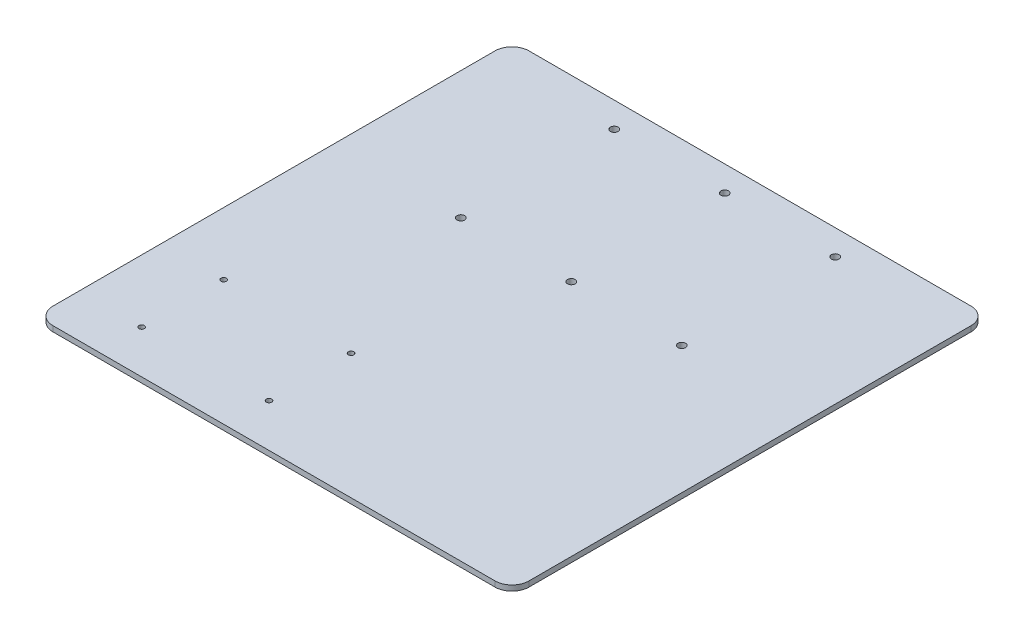
ISO-10303-21;
HEADER;
FILE_DESCRIPTION(('STEP AP214'),'2;1');
FILE_NAME('part.step','',(''),(''),'','','');
FILE_SCHEMA(('AUTOMOTIVE_DESIGN { 1 0 10303 214 1 1 1 1 }'));
ENDSEC;
DATA;
#1=APPLICATION_CONTEXT('core data for automotive mechanical design processes');
#2=APPLICATION_PROTOCOL_DEFINITION('international standard','automotive_design',2000,#1);
#3=PRODUCT_CONTEXT('',#1,'mechanical');
#4=PRODUCT('Part','Part','',(#3));
#5=PRODUCT_RELATED_PRODUCT_CATEGORY('part','',(#4));
#6=PRODUCT_DEFINITION_FORMATION('','',#4);
#7=PRODUCT_DEFINITION_CONTEXT('part definition',#1,'design');
#8=PRODUCT_DEFINITION('design','',#6,#7);
#9=PRODUCT_DEFINITION_SHAPE('','',#8);
#10=(LENGTH_UNIT() NAMED_UNIT(*) SI_UNIT(.MILLI.,.METRE.));
#11=(NAMED_UNIT(*) PLANE_ANGLE_UNIT() SI_UNIT($,.RADIAN.));
#12=(NAMED_UNIT(*) SI_UNIT($,.STERADIAN.) SOLID_ANGLE_UNIT());
#13=UNCERTAINTY_MEASURE_WITH_UNIT(LENGTH_MEASURE(1.E-05),#10,'distance_accuracy_value','');
#14=(GEOMETRIC_REPRESENTATION_CONTEXT(3) GLOBAL_UNCERTAINTY_ASSIGNED_CONTEXT((#13)) GLOBAL_UNIT_ASSIGNED_CONTEXT((#10,
#11,#12)) REPRESENTATION_CONTEXT('',''));
#15=CARTESIAN_POINT('',(0.,0.,0.));
#16=DIRECTION('',(0.,0.,1.));
#17=DIRECTION('',(1.,0.,0.));
#18=AXIS2_PLACEMENT_3D('',#15,#16,#17);
#19=CARTESIAN_POINT('',(0.,-3.18,0.));
#20=DIRECTION('',(0.,1.,0.));
#21=DIRECTION('',(0.,0.,1.));
#22=AXIS2_PLACEMENT_3D('',#19,#20,#21);
#23=PLANE('',#22);
#24=CARTESIAN_POINT('',(-65.,-3.18,-34.875));
#25=DIRECTION('',(0.,1.,0.));
#26=DIRECTION('',(0.,0.,1.));
#27=AXIS2_PLACEMENT_3D('',#24,#25,#26);
#28=CIRCLE('',#27,2.25);
#29=CARTESIAN_POINT('',(-65.,-3.18,-32.625));
#30=VERTEX_POINT('',#29);
#31=EDGE_CURVE('E210',#30,#30,#28,.T.);
#32=ORIENTED_EDGE('',*,*,#31,.T.);
#33=EDGE_LOOP('',(#32));
#34=FACE_BOUND('',#33,.T.);
#35=CARTESIAN_POINT('',(-28.285,-3.18,114.63));
#36=DIRECTION('',(0.,1.,0.));
#37=DIRECTION('',(0.,0.,1.));
#38=AXIS2_PLACEMENT_3D('',#35,#36,#37);
#39=CIRCLE('',#38,1.60000000000001);
#40=CARTESIAN_POINT('',(-28.285,-3.18,116.23));
#41=VERTEX_POINT('',#40);
#42=EDGE_CURVE('E219',#41,#41,#39,.T.);
#43=ORIENTED_EDGE('',*,*,#42,.T.);
#44=EDGE_LOOP('',(#43));
#45=FACE_BOUND('',#44,.T.);
#46=CARTESIAN_POINT('',(0.,-3.18,-34.875));
#47=DIRECTION('',(0.,1.,0.));
#48=DIRECTION('',(0.,0.,1.));
#49=AXIS2_PLACEMENT_3D('',#46,#47,#48);
#50=CIRCLE('',#49,2.25000000000001);
#51=CARTESIAN_POINT('',(0.,-3.18,-32.625));
#52=VERTEX_POINT('',#51);
#53=EDGE_CURVE('E222',#52,#52,#50,.T.);
#54=ORIENTED_EDGE('',*,*,#53,.T.);
#55=EDGE_LOOP('',(#54));
#56=FACE_BOUND('',#55,.T.);
#57=CARTESIAN_POINT('',(65.,-3.18,-34.875));
#58=DIRECTION('',(0.,1.,0.));
#59=DIRECTION('',(0.,0.,1.));
#60=AXIS2_PLACEMENT_3D('',#57,#58,#59);
#61=CIRCLE('',#60,2.25000000000001);
#62=CARTESIAN_POINT('',(65.,-3.18,-32.625));
#63=VERTEX_POINT('',#62);
#64=EDGE_CURVE('E225',#63,#63,#61,.T.);
#65=ORIENTED_EDGE('',*,*,#64,.T.);
#66=EDGE_LOOP('',(#65));
#67=FACE_BOUND('',#66,.T.);
#68=CARTESIAN_POINT('',(65.,-3.18,-125.125));
#69=DIRECTION('',(0.,1.,0.));
#70=DIRECTION('',(0.,0.,1.));
#71=AXIS2_PLACEMENT_3D('',#68,#69,#70);
#72=CIRCLE('',#71,2.25000000000001);
#73=CARTESIAN_POINT('',(65.,-3.18,-122.875));
#74=VERTEX_POINT('',#73);
#75=EDGE_CURVE('E228',#74,#74,#72,.T.);
#76=ORIENTED_EDGE('',*,*,#75,.T.);
#77=EDGE_LOOP('',(#76));
#78=FACE_BOUND('',#77,.T.);
#79=CARTESIAN_POINT('',(-103.215,-3.18,114.63));
#80=DIRECTION('',(0.,1.,0.));
#81=DIRECTION('',(0.,0.,1.));
#82=AXIS2_PLACEMENT_3D('',#79,#80,#81);
#83=CIRCLE('',#82,1.60000000000002);
#84=CARTESIAN_POINT('',(-103.215,-3.18,116.23));
#85=VERTEX_POINT('',#84);
#86=EDGE_CURVE('E231',#85,#85,#83,.T.);
#87=ORIENTED_EDGE('',*,*,#86,.T.);
#88=EDGE_LOOP('',(#87));
#89=FACE_BOUND('',#88,.T.);
#90=CARTESIAN_POINT('',(-65.,-3.18,-125.125));
#91=DIRECTION('',(0.,1.,0.));
#92=DIRECTION('',(0.,0.,1.));
#93=AXIS2_PLACEMENT_3D('',#90,#91,#92);
#94=CIRCLE('',#93,2.25000000000001);
#95=CARTESIAN_POINT('',(-65.,-3.18,-122.875));
#96=VERTEX_POINT('',#95);
#97=EDGE_CURVE('E234',#96,#96,#94,.T.);
#98=ORIENTED_EDGE('',*,*,#97,.T.);
#99=EDGE_LOOP('',(#98));
#100=FACE_BOUND('',#99,.T.);
#101=CARTESIAN_POINT('',(0.,-3.18,-125.125));
#102=DIRECTION('',(0.,1.,0.));
#103=DIRECTION('',(0.,0.,1.));
#104=AXIS2_PLACEMENT_3D('',#101,#102,#103);
#105=CIRCLE('',#104,2.25000000000002);
#106=CARTESIAN_POINT('',(0.,-3.18,-122.875));
#107=VERTEX_POINT('',#106);
#108=EDGE_CURVE('E237',#107,#107,#105,.T.);
#109=ORIENTED_EDGE('',*,*,#108,.T.);
#110=EDGE_LOOP('',(#109));
#111=FACE_BOUND('',#110,.T.);
#112=DIRECTION('',(1.,0.,0.));
#113=VECTOR('',#112,1.);
#114=CARTESIAN_POINT('',(-140.,-3.18,140.));
#115=LINE('',#114,#113);
#116=CARTESIAN_POINT('',(-130.,-3.18,140.));
#117=VERTEX_POINT('',#116);
#118=CARTESIAN_POINT('',(130.,-3.18,140.));
#119=VERTEX_POINT('',#118);
#120=EDGE_CURVE('E149',#117,#119,#115,.T.);
#121=ORIENTED_EDGE('',*,*,#120,.F.);
#122=CARTESIAN_POINT('',(-130.,-3.18,130.));
#123=DIRECTION('',(0.,1.,0.));
#124=DIRECTION('',(0.,0.,1.));
#125=AXIS2_PLACEMENT_3D('',#122,#123,#124);
#126=CIRCLE('',#125,10.);
#127=CARTESIAN_POINT('',(-140.,-3.18,130.));
#128=VERTEX_POINT('',#127);
#129=EDGE_CURVE('E195',#117,#128,#126,.F.);
#130=ORIENTED_EDGE('',*,*,#129,.T.);
#131=DIRECTION('',(0.,0.,1.));
#132=VECTOR('',#131,1.);
#133=CARTESIAN_POINT('',(-140.,-3.18,-140.));
#134=LINE('',#133,#132);
#135=CARTESIAN_POINT('',(-140.,-3.18,-130.));
#136=VERTEX_POINT('',#135);
#137=EDGE_CURVE('E153',#136,#128,#134,.T.);
#138=ORIENTED_EDGE('',*,*,#137,.F.);
#139=CARTESIAN_POINT('',(-130.,-3.18,-130.));
#140=DIRECTION('',(0.,1.,0.));
#141=DIRECTION('',(0.,0.,1.));
#142=AXIS2_PLACEMENT_3D('',#139,#140,#141);
#143=CIRCLE('',#142,10.);
#144=CARTESIAN_POINT('',(-130.,-3.18,-140.));
#145=VERTEX_POINT('',#144);
#146=EDGE_CURVE('E77',#136,#145,#143,.F.);
#147=ORIENTED_EDGE('',*,*,#146,.T.);
#148=DIRECTION('',(-1.,0.,0.));
#149=VECTOR('',#148,1.);
#150=CARTESIAN_POINT('',(-140.,-3.18,-140.));
#151=LINE('',#150,#149);
#152=CARTESIAN_POINT('',(130.,-3.18,-140.));
#153=VERTEX_POINT('',#152);
#154=EDGE_CURVE('E202',#153,#145,#151,.T.);
#155=ORIENTED_EDGE('',*,*,#154,.F.);
#156=CARTESIAN_POINT('',(130.,-3.18,-130.));
#157=DIRECTION('',(0.,1.,0.));
#158=DIRECTION('',(0.,0.,1.));
#159=AXIS2_PLACEMENT_3D('',#156,#157,#158);
#160=CIRCLE('',#159,10.);
#161=CARTESIAN_POINT('',(140.,-3.18,-130.));
#162=VERTEX_POINT('',#161);
#163=EDGE_CURVE('E191',#153,#162,#160,.F.);
#164=ORIENTED_EDGE('',*,*,#163,.T.);
#165=DIRECTION('',(0.,0.,-1.));
#166=VECTOR('',#165,1.);
#167=CARTESIAN_POINT('',(140.,-3.18,-140.));
#168=LINE('',#167,#166);
#169=CARTESIAN_POINT('',(140.,-3.18,130.));
#170=VERTEX_POINT('',#169);
#171=EDGE_CURVE('E204',#170,#162,#168,.T.);
#172=ORIENTED_EDGE('',*,*,#171,.F.);
#173=CARTESIAN_POINT('',(130.,-3.18,130.));
#174=DIRECTION('',(0.,1.,0.));
#175=DIRECTION('',(0.,0.,1.));
#176=AXIS2_PLACEMENT_3D('',#173,#174,#175);
#177=CIRCLE('',#176,10.);
#178=EDGE_CURVE('E193',#170,#119,#177,.F.);
#179=ORIENTED_EDGE('',*,*,#178,.T.);
#180=EDGE_LOOP('',(#121,#130,#138,#147,#155,#164,#172,#179));
#181=FACE_BOUND('',#180,.T.);
#182=CARTESIAN_POINT('',(-28.285,-3.18,66.37));
#183=DIRECTION('',(0.,1.,0.));
#184=DIRECTION('',(0.,0.,1.));
#185=AXIS2_PLACEMENT_3D('',#182,#183,#184);
#186=CIRCLE('',#185,1.59999999999996);
#187=CARTESIAN_POINT('',(-28.285,-3.18,67.97));
#188=VERTEX_POINT('',#187);
#189=EDGE_CURVE('E216',#188,#188,#186,.F.);
#190=ORIENTED_EDGE('',*,*,#189,.F.);
#191=EDGE_LOOP('',(#190));
#192=FACE_BOUND('',#191,.T.);
#193=CARTESIAN_POINT('',(-103.215,-3.18,66.37));
#194=DIRECTION('',(0.,1.,0.));
#195=DIRECTION('',(0.,0.,1.));
#196=AXIS2_PLACEMENT_3D('',#193,#194,#195);
#197=CIRCLE('',#196,1.60000000000002);
#198=CARTESIAN_POINT('',(-103.215,-3.18,67.97));
#199=VERTEX_POINT('',#198);
#200=EDGE_CURVE('E213',#199,#199,#197,.F.);
#201=ORIENTED_EDGE('',*,*,#200,.F.);
#202=EDGE_LOOP('',(#201));
#203=FACE_BOUND('',#202,.T.);
#204=ADVANCED_FACE('F62',(#34,#45,#56,#67,#78,#89,#100,#111,#181,#192,#203),#23,.F.);
#205=CARTESIAN_POINT('',(0.,0.,0.));
#206=DIRECTION('',(0.,1.,0.));
#207=DIRECTION('',(0.,0.,1.));
#208=AXIS2_PLACEMENT_3D('',#205,#206,#207);
#209=PLANE('',#208);
#210=CARTESIAN_POINT('',(-65.,0.,-34.875));
#211=DIRECTION('',(0.,1.,0.));
#212=DIRECTION('',(0.,0.,1.));
#213=AXIS2_PLACEMENT_3D('',#210,#211,#212);
#214=CIRCLE('',#213,2.25);
#215=CARTESIAN_POINT('',(-65.,0.,-32.625));
#216=VERTEX_POINT('',#215);
#217=EDGE_CURVE('E264',#216,#216,#214,.T.);
#218=ORIENTED_EDGE('',*,*,#217,.F.);
#219=EDGE_LOOP('',(#218));
#220=FACE_BOUND('',#219,.T.);
#221=CARTESIAN_POINT('',(-28.285,0.,66.37));
#222=DIRECTION('',(0.,1.,0.));
#223=DIRECTION('',(0.,0.,1.));
#224=AXIS2_PLACEMENT_3D('',#221,#222,#223);
#225=CIRCLE('',#224,1.59999999999996);
#226=CARTESIAN_POINT('',(-28.285,0.,67.97));
#227=VERTEX_POINT('',#226);
#228=EDGE_CURVE('E276',#227,#227,#225,.F.);
#229=ORIENTED_EDGE('',*,*,#228,.T.);
#230=EDGE_LOOP('',(#229));
#231=FACE_BOUND('',#230,.T.);
#232=CARTESIAN_POINT('',(-28.285,0.,114.63));
#233=DIRECTION('',(0.,1.,0.));
#234=DIRECTION('',(0.,0.,1.));
#235=AXIS2_PLACEMENT_3D('',#232,#233,#234);
#236=CIRCLE('',#235,1.60000000000001);
#237=CARTESIAN_POINT('',(-28.285,0.,116.23));
#238=VERTEX_POINT('',#237);
#239=EDGE_CURVE('E270',#238,#238,#236,.T.);
#240=ORIENTED_EDGE('',*,*,#239,.F.);
#241=EDGE_LOOP('',(#240));
#242=FACE_BOUND('',#241,.T.);
#243=CARTESIAN_POINT('',(0.,0.,-34.875));
#244=DIRECTION('',(0.,1.,0.));
#245=DIRECTION('',(0.,0.,1.));
#246=AXIS2_PLACEMENT_3D('',#243,#244,#245);
#247=CIRCLE('',#246,2.25000000000001);
#248=CARTESIAN_POINT('',(0.,0.,-32.625));
#249=VERTEX_POINT('',#248);
#250=EDGE_CURVE('E244',#249,#249,#247,.T.);
#251=ORIENTED_EDGE('',*,*,#250,.F.);
#252=EDGE_LOOP('',(#251));
#253=FACE_BOUND('',#252,.T.);
#254=CARTESIAN_POINT('',(65.,0.,-34.875));
#255=DIRECTION('',(0.,1.,0.));
#256=DIRECTION('',(0.,0.,1.));
#257=AXIS2_PLACEMENT_3D('',#254,#255,#256);
#258=CIRCLE('',#257,2.25000000000001);
#259=CARTESIAN_POINT('',(65.,0.,-32.625));
#260=VERTEX_POINT('',#259);
#261=EDGE_CURVE('E245',#260,#260,#258,.T.);
#262=ORIENTED_EDGE('',*,*,#261,.F.);
#263=EDGE_LOOP('',(#262));
#264=FACE_BOUND('',#263,.T.);
#265=CARTESIAN_POINT('',(65.,0.,-125.125));
#266=DIRECTION('',(0.,1.,0.));
#267=DIRECTION('',(0.,0.,1.));
#268=AXIS2_PLACEMENT_3D('',#265,#266,#267);
#269=CIRCLE('',#268,2.25000000000001);
#270=CARTESIAN_POINT('',(65.,0.,-122.875));
#271=VERTEX_POINT('',#270);
#272=EDGE_CURVE('E250',#271,#271,#269,.T.);
#273=ORIENTED_EDGE('',*,*,#272,.F.);
#274=EDGE_LOOP('',(#273));
#275=FACE_BOUND('',#274,.T.);
#276=CARTESIAN_POINT('',(-103.215,0.,114.63));
#277=DIRECTION('',(0.,1.,0.));
#278=DIRECTION('',(0.,0.,1.));
#279=AXIS2_PLACEMENT_3D('',#276,#277,#278);
#280=CIRCLE('',#279,1.60000000000002);
#281=CARTESIAN_POINT('',(-103.215,0.,116.23));
#282=VERTEX_POINT('',#281);
#283=EDGE_CURVE('E263',#282,#282,#280,.T.);
#284=ORIENTED_EDGE('',*,*,#283,.F.);
#285=EDGE_LOOP('',(#284));
#286=FACE_BOUND('',#285,.T.);
#287=CARTESIAN_POINT('',(-65.,0.,-125.125));
#288=DIRECTION('',(0.,1.,0.));
#289=DIRECTION('',(0.,0.,1.));
#290=AXIS2_PLACEMENT_3D('',#287,#288,#289);
#291=CIRCLE('',#290,2.25000000000001);
#292=CARTESIAN_POINT('',(-65.,0.,-122.875));
#293=VERTEX_POINT('',#292);
#294=EDGE_CURVE('E287',#293,#293,#291,.T.);
#295=ORIENTED_EDGE('',*,*,#294,.F.);
#296=EDGE_LOOP('',(#295));
#297=FACE_BOUND('',#296,.T.);
#298=CARTESIAN_POINT('',(0.,0.,-125.125));
#299=DIRECTION('',(0.,1.,0.));
#300=DIRECTION('',(0.,0.,1.));
#301=AXIS2_PLACEMENT_3D('',#298,#299,#300);
#302=CIRCLE('',#301,2.25000000000002);
#303=CARTESIAN_POINT('',(0.,0.,-122.875));
#304=VERTEX_POINT('',#303);
#305=EDGE_CURVE('E239',#304,#304,#302,.T.);
#306=ORIENTED_EDGE('',*,*,#305,.F.);
#307=EDGE_LOOP('',(#306));
#308=FACE_BOUND('',#307,.T.);
#309=DIRECTION('',(0.,0.,1.));
#310=VECTOR('',#309,1.);
#311=CARTESIAN_POINT('',(-140.,0.,-140.));
#312=LINE('',#311,#310);
#313=CARTESIAN_POINT('',(-140.,0.,-130.));
#314=VERTEX_POINT('',#313);
#315=CARTESIAN_POINT('',(-140.,0.,130.));
#316=VERTEX_POINT('',#315);
#317=EDGE_CURVE('E131',#314,#316,#312,.T.);
#318=ORIENTED_EDGE('',*,*,#317,.T.);
#319=CARTESIAN_POINT('',(-130.,0.,130.));
#320=DIRECTION('',(0.,1.,0.));
#321=DIRECTION('',(0.,0.,1.));
#322=AXIS2_PLACEMENT_3D('',#319,#320,#321);
#323=CIRCLE('',#322,10.);
#324=CARTESIAN_POINT('',(-130.,0.,140.));
#325=VERTEX_POINT('',#324);
#326=EDGE_CURVE('E181',#316,#325,#323,.T.);
#327=ORIENTED_EDGE('',*,*,#326,.T.);
#328=DIRECTION('',(1.,0.,0.));
#329=VECTOR('',#328,1.);
#330=CARTESIAN_POINT('',(-140.,0.,140.));
#331=LINE('',#330,#329);
#332=CARTESIAN_POINT('',(130.,0.,140.));
#333=VERTEX_POINT('',#332);
#334=EDGE_CURVE('E147',#325,#333,#331,.T.);
#335=ORIENTED_EDGE('',*,*,#334,.T.);
#336=CARTESIAN_POINT('',(130.,0.,130.));
#337=DIRECTION('',(0.,1.,0.));
#338=DIRECTION('',(0.,0.,1.));
#339=AXIS2_PLACEMENT_3D('',#336,#337,#338);
#340=CIRCLE('',#339,10.);
#341=CARTESIAN_POINT('',(140.,0.,130.));
#342=VERTEX_POINT('',#341);
#343=EDGE_CURVE('E162',#333,#342,#340,.T.);
#344=ORIENTED_EDGE('',*,*,#343,.T.);
#345=DIRECTION('',(0.,0.,-1.));
#346=VECTOR('',#345,1.);
#347=CARTESIAN_POINT('',(140.,0.,-140.));
#348=LINE('',#347,#346);
#349=CARTESIAN_POINT('',(140.,0.,-130.));
#350=VERTEX_POINT('',#349);
#351=EDGE_CURVE('E172',#342,#350,#348,.T.);
#352=ORIENTED_EDGE('',*,*,#351,.T.);
#353=CARTESIAN_POINT('',(130.,0.,-130.));
#354=DIRECTION('',(0.,1.,0.));
#355=DIRECTION('',(0.,0.,1.));
#356=AXIS2_PLACEMENT_3D('',#353,#354,#355);
#357=CIRCLE('',#356,10.);
#358=CARTESIAN_POINT('',(130.,0.,-140.));
#359=VERTEX_POINT('',#358);
#360=EDGE_CURVE('E138',#350,#359,#357,.T.);
#361=ORIENTED_EDGE('',*,*,#360,.T.);
#362=DIRECTION('',(-1.,0.,0.));
#363=VECTOR('',#362,1.);
#364=CARTESIAN_POINT('',(-140.,0.,-140.));
#365=LINE('',#364,#363);
#366=CARTESIAN_POINT('',(-130.,0.,-140.));
#367=VERTEX_POINT('',#366);
#368=EDGE_CURVE('E132',#359,#367,#365,.T.);
#369=ORIENTED_EDGE('',*,*,#368,.T.);
#370=CARTESIAN_POINT('',(-130.,0.,-130.));
#371=DIRECTION('',(0.,1.,0.));
#372=DIRECTION('',(0.,0.,1.));
#373=AXIS2_PLACEMENT_3D('',#370,#371,#372);
#374=CIRCLE('',#373,10.);
#375=EDGE_CURVE('E127',#367,#314,#374,.T.);
#376=ORIENTED_EDGE('',*,*,#375,.T.);
#377=EDGE_LOOP('',(#318,#327,#335,#344,#352,#361,#369,#376));
#378=FACE_BOUND('',#377,.T.);
#379=CARTESIAN_POINT('',(-103.215,0.,66.37));
#380=DIRECTION('',(0.,1.,0.));
#381=DIRECTION('',(0.,0.,1.));
#382=AXIS2_PLACEMENT_3D('',#379,#380,#381);
#383=CIRCLE('',#382,1.60000000000002);
#384=CARTESIAN_POINT('',(-103.215,0.,67.97));
#385=VERTEX_POINT('',#384);
#386=EDGE_CURVE('E283',#385,#385,#383,.F.);
#387=ORIENTED_EDGE('',*,*,#386,.T.);
#388=EDGE_LOOP('',(#387));
#389=FACE_BOUND('',#388,.T.);
#390=ADVANCED_FACE('F129',(#220,#231,#242,#253,#264,#275,#286,#297,#308,#378,#389),#209,.T.);
#391=CARTESIAN_POINT('',(140.,-3.18,-140.));
#392=DIRECTION('',(1.,0.,0.));
#393=DIRECTION('',(0.,0.,-1.));
#394=AXIS2_PLACEMENT_3D('',#391,#392,#393);
#395=PLANE('',#394);
#396=ORIENTED_EDGE('',*,*,#351,.F.);
#397=DIRECTION('',(0.,1.,0.));
#398=VECTOR('',#397,1.);
#399=CARTESIAN_POINT('',(140.,-3.18,130.));
#400=LINE('',#399,#398);
#401=EDGE_CURVE('E200',#342,#170,#400,.F.);
#402=ORIENTED_EDGE('',*,*,#401,.T.);
#403=ORIENTED_EDGE('',*,*,#171,.T.);
#404=DIRECTION('',(0.,1.,0.));
#405=VECTOR('',#404,1.);
#406=CARTESIAN_POINT('',(140.,-3.18,-130.));
#407=LINE('',#406,#405);
#408=EDGE_CURVE('E197',#162,#350,#407,.T.);
#409=ORIENTED_EDGE('',*,*,#408,.T.);
#410=EDGE_LOOP('',(#396,#402,#403,#409));
#411=FACE_BOUND('',#410,.T.);
#412=ADVANCED_FACE('F305',(#411),#395,.T.);
#413=CARTESIAN_POINT('',(-140.,-3.18,140.));
#414=DIRECTION('',(0.,0.,1.));
#415=DIRECTION('',(1.,0.,0.));
#416=AXIS2_PLACEMENT_3D('',#413,#414,#415);
#417=PLANE('',#416);
#418=ORIENTED_EDGE('',*,*,#334,.F.);
#419=DIRECTION('',(0.,1.,0.));
#420=VECTOR('',#419,1.);
#421=CARTESIAN_POINT('',(-130.,-3.18,140.));
#422=LINE('',#421,#420);
#423=EDGE_CURVE('E188',#325,#117,#422,.F.);
#424=ORIENTED_EDGE('',*,*,#423,.T.);
#425=ORIENTED_EDGE('',*,*,#120,.T.);
#426=DIRECTION('',(0.,1.,0.));
#427=VECTOR('',#426,1.);
#428=CARTESIAN_POINT('',(130.,-3.18,140.));
#429=LINE('',#428,#427);
#430=EDGE_CURVE('E185',#119,#333,#429,.T.);
#431=ORIENTED_EDGE('',*,*,#430,.T.);
#432=EDGE_LOOP('',(#418,#424,#425,#431));
#433=FACE_BOUND('',#432,.T.);
#434=ADVANCED_FACE('F358',(#433),#417,.T.);
#435=CARTESIAN_POINT('',(-140.,-3.18,-140.));
#436=DIRECTION('',(-1.,0.,0.));
#437=DIRECTION('',(0.,0.,1.));
#438=AXIS2_PLACEMENT_3D('',#435,#436,#437);
#439=PLANE('',#438);
#440=ORIENTED_EDGE('',*,*,#137,.T.);
#441=DIRECTION('',(0.,1.,0.));
#442=VECTOR('',#441,1.);
#443=CARTESIAN_POINT('',(-140.,-3.18,130.));
#444=LINE('',#443,#442);
#445=EDGE_CURVE('E139',#128,#316,#444,.T.);
#446=ORIENTED_EDGE('',*,*,#445,.T.);
#447=ORIENTED_EDGE('',*,*,#317,.F.);
#448=DIRECTION('',(0.,1.,0.));
#449=VECTOR('',#448,1.);
#450=CARTESIAN_POINT('',(-140.,-3.18,-130.));
#451=LINE('',#450,#449);
#452=EDGE_CURVE('E144',#314,#136,#451,.F.);
#453=ORIENTED_EDGE('',*,*,#452,.T.);
#454=EDGE_LOOP('',(#440,#446,#447,#453));
#455=FACE_BOUND('',#454,.T.);
#456=ADVANCED_FACE('F143',(#455),#439,.T.);
#457=CARTESIAN_POINT('',(-140.,-3.18,-140.));
#458=DIRECTION('',(0.,0.,-1.));
#459=DIRECTION('',(-1.,0.,0.));
#460=AXIS2_PLACEMENT_3D('',#457,#458,#459);
#461=PLANE('',#460);
#462=ORIENTED_EDGE('',*,*,#368,.F.);
#463=DIRECTION('',(0.,1.,0.));
#464=VECTOR('',#463,1.);
#465=CARTESIAN_POINT('',(130.,-3.18,-140.));
#466=LINE('',#465,#464);
#467=EDGE_CURVE('E13',#359,#153,#466,.F.);
#468=ORIENTED_EDGE('',*,*,#467,.T.);
#469=ORIENTED_EDGE('',*,*,#154,.T.);
#470=DIRECTION('',(0.,1.,0.));
#471=VECTOR('',#470,1.);
#472=CARTESIAN_POINT('',(-130.,-3.18,-140.));
#473=LINE('',#472,#471);
#474=EDGE_CURVE('E70',#145,#367,#473,.T.);
#475=ORIENTED_EDGE('',*,*,#474,.T.);
#476=EDGE_LOOP('',(#462,#468,#469,#475));
#477=FACE_BOUND('',#476,.T.);
#478=ADVANCED_FACE('F201',(#477),#461,.T.);
#479=CARTESIAN_POINT('',(0.,-10.,-125.125));
#480=DIRECTION('',(0.,1.,0.));
#481=DIRECTION('',(0.,0.,1.));
#482=AXIS2_PLACEMENT_3D('',#479,#480,#481);
#483=CYLINDRICAL_SURFACE('',#482,2.25000000000002);
#484=ORIENTED_EDGE('',*,*,#305,.T.);
#485=EDGE_LOOP('',(#484));
#486=FACE_BOUND('',#485,.T.);
#487=ORIENTED_EDGE('',*,*,#108,.F.);
#488=EDGE_LOOP('',(#487));
#489=FACE_BOUND('',#488,.T.);
#490=ADVANCED_FACE('F310',(#486,#489),#483,.F.);
#491=CARTESIAN_POINT('',(-65.,-10.,-125.125));
#492=DIRECTION('',(0.,1.,0.));
#493=DIRECTION('',(0.,0.,1.));
#494=AXIS2_PLACEMENT_3D('',#491,#492,#493);
#495=CYLINDRICAL_SURFACE('',#494,2.25000000000001);
#496=ORIENTED_EDGE('',*,*,#294,.T.);
#497=EDGE_LOOP('',(#496));
#498=FACE_BOUND('',#497,.T.);
#499=ORIENTED_EDGE('',*,*,#97,.F.);
#500=EDGE_LOOP('',(#499));
#501=FACE_BOUND('',#500,.T.);
#502=ADVANCED_FACE('F300',(#498,#501),#495,.F.);
#503=CARTESIAN_POINT('',(-103.215,-10.,114.63));
#504=DIRECTION('',(0.,1.,0.));
#505=DIRECTION('',(0.,0.,1.));
#506=AXIS2_PLACEMENT_3D('',#503,#504,#505);
#507=CYLINDRICAL_SURFACE('',#506,1.60000000000002);
#508=ORIENTED_EDGE('',*,*,#283,.T.);
#509=EDGE_LOOP('',(#508));
#510=FACE_BOUND('',#509,.T.);
#511=ORIENTED_EDGE('',*,*,#86,.F.);
#512=EDGE_LOOP('',(#511));
#513=FACE_BOUND('',#512,.T.);
#514=ADVANCED_FACE('F347',(#510,#513),#507,.F.);
#515=CARTESIAN_POINT('',(65.,-10.,-125.125));
#516=DIRECTION('',(0.,1.,0.));
#517=DIRECTION('',(0.,0.,1.));
#518=AXIS2_PLACEMENT_3D('',#515,#516,#517);
#519=CYLINDRICAL_SURFACE('',#518,2.25000000000001);
#520=ORIENTED_EDGE('',*,*,#272,.T.);
#521=EDGE_LOOP('',(#520));
#522=FACE_BOUND('',#521,.T.);
#523=ORIENTED_EDGE('',*,*,#75,.F.);
#524=EDGE_LOOP('',(#523));
#525=FACE_BOUND('',#524,.T.);
#526=ADVANCED_FACE('F343',(#522,#525),#519,.F.);
#527=CARTESIAN_POINT('',(65.,-10.,-34.875));
#528=DIRECTION('',(0.,1.,0.));
#529=DIRECTION('',(0.,0.,1.));
#530=AXIS2_PLACEMENT_3D('',#527,#528,#529);
#531=CYLINDRICAL_SURFACE('',#530,2.25000000000001);
#532=ORIENTED_EDGE('',*,*,#261,.T.);
#533=EDGE_LOOP('',(#532));
#534=FACE_BOUND('',#533,.T.);
#535=ORIENTED_EDGE('',*,*,#64,.F.);
#536=EDGE_LOOP('',(#535));
#537=FACE_BOUND('',#536,.T.);
#538=ADVANCED_FACE('F346',(#534,#537),#531,.F.);
#539=CARTESIAN_POINT('',(0.,-10.,-34.875));
#540=DIRECTION('',(0.,1.,0.));
#541=DIRECTION('',(0.,0.,1.));
#542=AXIS2_PLACEMENT_3D('',#539,#540,#541);
#543=CYLINDRICAL_SURFACE('',#542,2.25000000000001);
#544=ORIENTED_EDGE('',*,*,#250,.T.);
#545=EDGE_LOOP('',(#544));
#546=FACE_BOUND('',#545,.T.);
#547=ORIENTED_EDGE('',*,*,#53,.F.);
#548=EDGE_LOOP('',(#547));
#549=FACE_BOUND('',#548,.T.);
#550=ADVANCED_FACE('F351',(#546,#549),#543,.F.);
#551=CARTESIAN_POINT('',(-28.285,-10.,114.63));
#552=DIRECTION('',(0.,1.,0.));
#553=DIRECTION('',(0.,0.,1.));
#554=AXIS2_PLACEMENT_3D('',#551,#552,#553);
#555=CYLINDRICAL_SURFACE('',#554,1.60000000000001);
#556=ORIENTED_EDGE('',*,*,#239,.T.);
#557=EDGE_LOOP('',(#556));
#558=FACE_BOUND('',#557,.T.);
#559=ORIENTED_EDGE('',*,*,#42,.F.);
#560=EDGE_LOOP('',(#559));
#561=FACE_BOUND('',#560,.T.);
#562=ADVANCED_FACE('F338',(#558,#561),#555,.F.);
#563=CARTESIAN_POINT('',(-28.285,-10.,66.37));
#564=DIRECTION('',(0.,1.,0.));
#565=DIRECTION('',(0.,0.,1.));
#566=AXIS2_PLACEMENT_3D('',#563,#564,#565);
#567=CYLINDRICAL_SURFACE('',#566,1.59999999999996);
#568=ORIENTED_EDGE('',*,*,#228,.F.);
#569=EDGE_LOOP('',(#568));
#570=FACE_BOUND('',#569,.T.);
#571=ORIENTED_EDGE('',*,*,#189,.T.);
#572=EDGE_LOOP('',(#571));
#573=FACE_BOUND('',#572,.T.);
#574=ADVANCED_FACE('F329',(#570,#573),#567,.F.);
#575=CARTESIAN_POINT('',(-103.215,-10.,66.37));
#576=DIRECTION('',(0.,1.,0.));
#577=DIRECTION('',(0.,0.,1.));
#578=AXIS2_PLACEMENT_3D('',#575,#576,#577);
#579=CYLINDRICAL_SURFACE('',#578,1.60000000000002);
#580=ORIENTED_EDGE('',*,*,#386,.F.);
#581=EDGE_LOOP('',(#580));
#582=FACE_BOUND('',#581,.T.);
#583=ORIENTED_EDGE('',*,*,#200,.T.);
#584=EDGE_LOOP('',(#583));
#585=FACE_BOUND('',#584,.T.);
#586=ADVANCED_FACE('F326',(#582,#585),#579,.F.);
#587=CARTESIAN_POINT('',(-65.,-10.,-34.875));
#588=DIRECTION('',(0.,1.,0.));
#589=DIRECTION('',(0.,0.,1.));
#590=AXIS2_PLACEMENT_3D('',#587,#588,#589);
#591=CYLINDRICAL_SURFACE('',#590,2.25);
#592=ORIENTED_EDGE('',*,*,#217,.T.);
#593=EDGE_LOOP('',(#592));
#594=FACE_BOUND('',#593,.T.);
#595=ORIENTED_EDGE('',*,*,#31,.F.);
#596=EDGE_LOOP('',(#595));
#597=FACE_BOUND('',#596,.T.);
#598=ADVANCED_FACE('F328',(#594,#597),#591,.F.);
#599=CARTESIAN_POINT('',(-130.,-3.18,130.));
#600=DIRECTION('',(0.,1.,0.));
#601=DIRECTION('',(0.,0.,1.));
#602=AXIS2_PLACEMENT_3D('',#599,#600,#601);
#603=CYLINDRICAL_SURFACE('',#602,10.);
#604=ORIENTED_EDGE('',*,*,#129,.F.);
#605=ORIENTED_EDGE('',*,*,#423,.F.);
#606=ORIENTED_EDGE('',*,*,#326,.F.);
#607=ORIENTED_EDGE('',*,*,#445,.F.);
#608=EDGE_LOOP('',(#604,#605,#606,#607));
#609=FACE_BOUND('',#608,.T.);
#610=ADVANCED_FACE('F336',(#609),#603,.T.);
#611=CARTESIAN_POINT('',(130.,-3.18,130.));
#612=DIRECTION('',(0.,1.,0.));
#613=DIRECTION('',(0.,0.,1.));
#614=AXIS2_PLACEMENT_3D('',#611,#612,#613);
#615=CYLINDRICAL_SURFACE('',#614,10.);
#616=ORIENTED_EDGE('',*,*,#178,.F.);
#617=ORIENTED_EDGE('',*,*,#401,.F.);
#618=ORIENTED_EDGE('',*,*,#343,.F.);
#619=ORIENTED_EDGE('',*,*,#430,.F.);
#620=EDGE_LOOP('',(#616,#617,#618,#619));
#621=FACE_BOUND('',#620,.T.);
#622=ADVANCED_FACE('F371',(#621),#615,.T.);
#623=CARTESIAN_POINT('',(130.,-3.18,-130.));
#624=DIRECTION('',(0.,1.,0.));
#625=DIRECTION('',(0.,0.,1.));
#626=AXIS2_PLACEMENT_3D('',#623,#624,#625);
#627=CYLINDRICAL_SURFACE('',#626,10.);
#628=ORIENTED_EDGE('',*,*,#163,.F.);
#629=ORIENTED_EDGE('',*,*,#467,.F.);
#630=ORIENTED_EDGE('',*,*,#360,.F.);
#631=ORIENTED_EDGE('',*,*,#408,.F.);
#632=EDGE_LOOP('',(#628,#629,#630,#631));
#633=FACE_BOUND('',#632,.T.);
#634=ADVANCED_FACE('F374',(#633),#627,.T.);
#635=CARTESIAN_POINT('',(-130.,-3.18,-130.));
#636=DIRECTION('',(0.,1.,0.));
#637=DIRECTION('',(0.,0.,1.));
#638=AXIS2_PLACEMENT_3D('',#635,#636,#637);
#639=CYLINDRICAL_SURFACE('',#638,10.);
#640=ORIENTED_EDGE('',*,*,#146,.F.);
#641=ORIENTED_EDGE('',*,*,#452,.F.);
#642=ORIENTED_EDGE('',*,*,#375,.F.);
#643=ORIENTED_EDGE('',*,*,#474,.F.);
#644=EDGE_LOOP('',(#640,#641,#642,#643));
#645=FACE_BOUND('',#644,.T.);
#646=ADVANCED_FACE('F64',(#645),#639,.T.);
#647=CLOSED_SHELL('',(#204,#390,#412,#434,#456,#478,#490,#502,#514,#526,#538,#550,#562,#574,
#586,#598,#610,#622,#634,#646));
#648=MANIFOLD_SOLID_BREP('B2',#647);
#649=ADVANCED_BREP_SHAPE_REPRESENTATION('',(#18,#648),#14);
#650=SHAPE_DEFINITION_REPRESENTATION(#9,#649);
ENDSEC;
END-ISO-10303-21;
